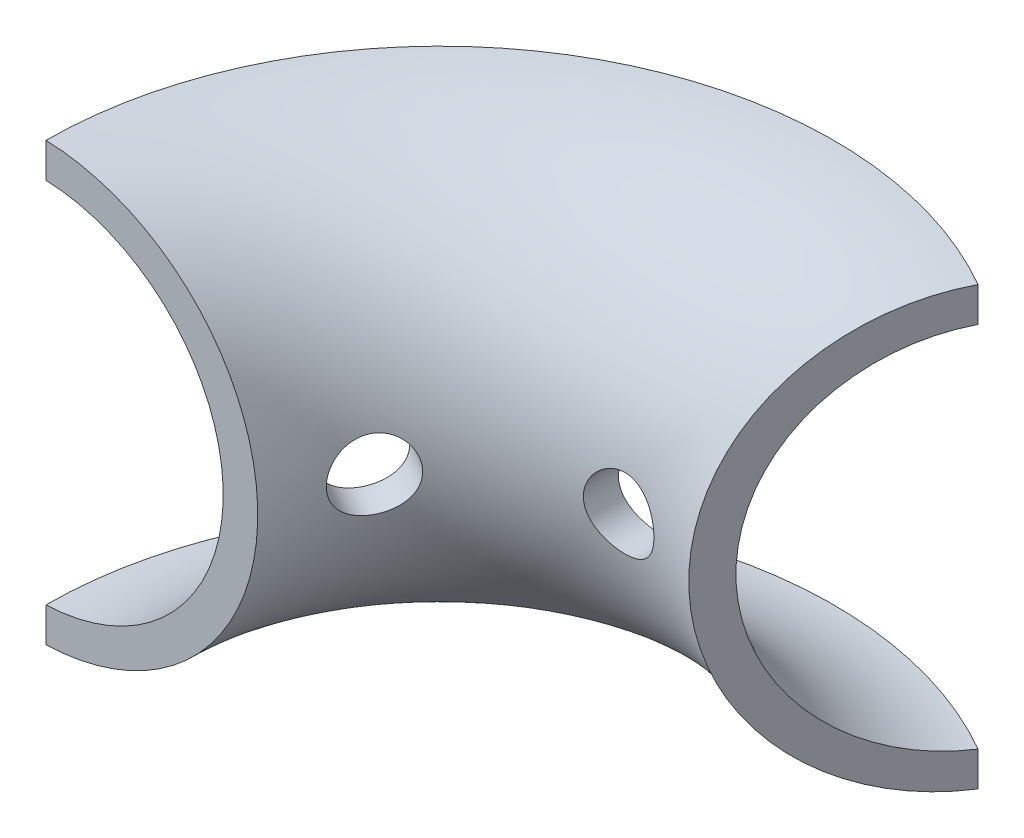
ISO-10303-21;
HEADER;
FILE_DESCRIPTION(('STEP AP214'),'2;1');
FILE_NAME('part.step','',(''),(''),'','','');
FILE_SCHEMA(('AUTOMOTIVE_DESIGN { 1 0 10303 214 1 1 1 1 }'));
ENDSEC;
DATA;
#1=APPLICATION_CONTEXT('core data for automotive mechanical design processes');
#2=APPLICATION_PROTOCOL_DEFINITION('international standard','automotive_design',2000,#1);
#3=PRODUCT_CONTEXT('',#1,'mechanical');
#4=PRODUCT('Part','Part','',(#3));
#5=PRODUCT_RELATED_PRODUCT_CATEGORY('part','',(#4));
#6=PRODUCT_DEFINITION_FORMATION('','',#4);
#7=PRODUCT_DEFINITION_CONTEXT('part definition',#1,'design');
#8=PRODUCT_DEFINITION('design','',#6,#7);
#9=PRODUCT_DEFINITION_SHAPE('','',#8);
#10=(LENGTH_UNIT() NAMED_UNIT(*) SI_UNIT(.MILLI.,.METRE.));
#11=(NAMED_UNIT(*) PLANE_ANGLE_UNIT() SI_UNIT($,.RADIAN.));
#12=(NAMED_UNIT(*) SI_UNIT($,.STERADIAN.) SOLID_ANGLE_UNIT());
#13=UNCERTAINTY_MEASURE_WITH_UNIT(LENGTH_MEASURE(1.E-05),#10,'distance_accuracy_value','');
#14=(GEOMETRIC_REPRESENTATION_CONTEXT(3) GLOBAL_UNCERTAINTY_ASSIGNED_CONTEXT((#13)) GLOBAL_UNIT_ASSIGNED_CONTEXT((#10,
#11,#12)) REPRESENTATION_CONTEXT('',''));
#15=CARTESIAN_POINT('',(0.,0.,0.));
#16=DIRECTION('',(0.,0.,1.));
#17=DIRECTION('',(1.,0.,0.));
#18=AXIS2_PLACEMENT_3D('',#15,#16,#17);
#19=CARTESIAN_POINT('',(44.2949999999999,0.,-25.5737301737545));
#20=DIRECTION('',(-0.86602540378444,0.,-0.499999999999998));
#21=DIRECTION('',(-0.499999999999998,0.,0.86602540378444));
#22=AXIS2_PLACEMENT_3D('',#19,#20,#21);
#23=PLANE('',#22);
#24=CARTESIAN_POINT('',(44.2949999999999,0.,-25.5737301737545));
#25=DIRECTION('',(-0.86602540378444,0.,-0.499999999999998));
#26=DIRECTION('',(-0.499999999999998,0.,0.86602540378444));
#27=AXIS2_PLACEMENT_3D('',#24,#25,#26);
#28=CIRCLE('',#27,16.105);
#29=CARTESIAN_POINT('',(44.0449999999999,-16.0972365640814,-25.1407174718623));
#30=VERTEX_POINT('',#29);
#31=CARTESIAN_POINT('',(44.0449999999999,16.0972365640814,-25.1407174718623));
#32=VERTEX_POINT('',#31);
#33=EDGE_CURVE('E81',#30,#32,#28,.T.);
#34=ORIENTED_EDGE('',*,*,#33,.F.);
#35=DIRECTION('',(0.,-1.,0.));
#36=VECTOR('',#35,1.);
#37=CARTESIAN_POINT('',(44.0449999999999,-16.0972365640814,-25.1407174718623));
#38=LINE('',#37,#36);
#39=CARTESIAN_POINT('',(44.0449999999999,-13.5507785754177,-25.1407174718623));
#40=VERTEX_POINT('',#39);
#41=EDGE_CURVE('E69',#40,#30,#38,.T.);
#42=ORIENTED_EDGE('',*,*,#41,.F.);
#43=CARTESIAN_POINT('',(44.2949999999999,0.,-25.5737301737545));
#44=DIRECTION('',(0.86602540378444,0.,0.499999999999998));
#45=DIRECTION('',(-0.499999999999998,0.,0.86602540378444));
#46=AXIS2_PLACEMENT_3D('',#43,#44,#45);
#47=CIRCLE('',#46,13.56);
#48=CARTESIAN_POINT('',(44.0449999999999,13.5507785754177,-25.1407174718623));
#49=VERTEX_POINT('',#48);
#50=EDGE_CURVE('E74',#49,#40,#47,.T.);
#51=ORIENTED_EDGE('',*,*,#50,.F.);
#52=DIRECTION('',(0.,-1.,0.));
#53=VECTOR('',#52,1.);
#54=CARTESIAN_POINT('',(44.0449999999999,16.0972365640814,-25.1407174718623));
#55=LINE('',#54,#53);
#56=EDGE_CURVE('E78',#32,#49,#55,.T.);
#57=ORIENTED_EDGE('',*,*,#56,.F.);
#58=EDGE_LOOP('',(#34,#42,#51,#57));
#59=FACE_BOUND('',#58,.T.);
#60=ADVANCED_FACE('F38',(#59),#23,.F.);
#61=CARTESIAN_POINT('',(0.,0.,0.));
#62=DIRECTION('',(0.,0.,1.));
#63=DIRECTION('',(1.,0.,0.));
#64=AXIS2_PLACEMENT_3D('',#61,#62,#63);
#65=PLANE('',#64);
#66=CARTESIAN_POINT('',(0.,0.,0.));
#67=DIRECTION('',(0.,0.,1.));
#68=DIRECTION('',(1.,0.,0.));
#69=AXIS2_PLACEMENT_3D('',#66,#67,#68);
#70=CIRCLE('',#69,16.105);
#71=CARTESIAN_POINT('',(0.500000000000007,-16.0972365640814,0.));
#72=VERTEX_POINT('',#71);
#73=CARTESIAN_POINT('',(0.500000000000007,16.0972365640814,0.));
#74=VERTEX_POINT('',#73);
#75=EDGE_CURVE('E98',#72,#74,#70,.T.);
#76=ORIENTED_EDGE('',*,*,#75,.T.);
#77=DIRECTION('',(0.,-1.,0.));
#78=VECTOR('',#77,1.);
#79=CARTESIAN_POINT('',(0.500000000000004,16.0972365640814,0.));
#80=LINE('',#79,#78);
#81=CARTESIAN_POINT('',(0.500000000000005,13.5507785754177,0.));
#82=VERTEX_POINT('',#81);
#83=EDGE_CURVE('E58',#74,#82,#80,.T.);
#84=ORIENTED_EDGE('',*,*,#83,.T.);
#85=CARTESIAN_POINT('',(0.,0.,0.));
#86=DIRECTION('',(0.,0.,-1.));
#87=DIRECTION('',(1.,0.,0.));
#88=AXIS2_PLACEMENT_3D('',#85,#86,#87);
#89=CIRCLE('',#88,13.56);
#90=CARTESIAN_POINT('',(0.500000000000004,-13.5507785754177,0.));
#91=VERTEX_POINT('',#90);
#92=EDGE_CURVE('E52',#82,#91,#89,.T.);
#93=ORIENTED_EDGE('',*,*,#92,.T.);
#94=DIRECTION('',(0.,-1.,0.));
#95=VECTOR('',#94,1.);
#96=CARTESIAN_POINT('',(0.500000000000004,-16.0972365640814,0.));
#97=LINE('',#96,#95);
#98=EDGE_CURVE('E11',#91,#72,#97,.T.);
#99=ORIENTED_EDGE('',*,*,#98,.T.);
#100=EDGE_LOOP('',(#76,#84,#93,#99));
#101=FACE_BOUND('',#100,.T.);
#102=ADVANCED_FACE('F135',(#101),#65,.T.);
#103=CARTESIAN_POINT('',(29.53,0.,0.));
#104=DIRECTION('',(0.,1.,0.));
#105=DIRECTION('',(0.,0.,1.));
#106=AXIS2_PLACEMENT_3D('',#103,#104,#105);
#107=TOROIDAL_SURFACE('',#106,29.53,16.105);
#108=CARTESIAN_POINT('',(27.7740271270852,1.91743559724648,-13.4252));
#109=CARTESIAN_POINT('',(27.6666933513547,1.81913378740206,-13.3992731930195));
#110=CARTESIAN_POINT('',(27.567584001212,1.71176696967699,-13.3729036746234));
#111=CARTESIAN_POINT('',(27.3884140460133,1.48153353165593,-13.3221542333845));
#112=CARTESIAN_POINT('',(27.3083840845655,1.35864245549103,-13.2977775519655));
#113=CARTESIAN_POINT('',(27.1697218467155,1.10026924068495,-13.2537770078409));
#114=CARTESIAN_POINT('',(27.1111184042808,0.964770440829677,-13.2341595615552));
#115=CARTESIAN_POINT('',(27.0175602464365,0.685099184341573,-13.2021212578841));
#116=CARTESIAN_POINT('',(26.9825880799598,0.540933214049031,-13.1896950909063));
#117=CARTESIAN_POINT('',(26.9385011840134,0.253816949068898,-13.1739307515622));
#118=CARTESIAN_POINT('',(26.928457316239,0.111027400604963,-13.1702662123766));
#119=CARTESIAN_POINT('',(26.9319266458047,-0.174218058510046,-13.1715222926748));
#120=CARTESIAN_POINT('',(26.9454370446311,-0.316674006783006,-13.1764418922657));
#121=CARTESIAN_POINT('',(26.9945999789083,-0.592172289418696,-13.1939451777186));
#122=CARTESIAN_POINT('',(27.0294855782491,-0.725370024919686,-13.2062631229108));
#123=CARTESIAN_POINT('',(27.1195011908097,-0.984000927334418,-13.2369579396884));
#124=CARTESIAN_POINT('',(27.1746371560329,-1.10943179872603,-13.2553365924793));
#125=CARTESIAN_POINT('',(27.3083045800673,-1.35849031424794,-13.2977524840224));
#126=CARTESIAN_POINT('',(27.3882665908346,-1.48129604132837,-13.3221080499601));
#127=CARTESIAN_POINT('',(27.5673767187898,-1.71154848421269,-13.3728493561855));
#128=CARTESIAN_POINT('',(27.666529956115,-1.81899108787009,-13.3992356371251));
#129=CARTESIAN_POINT('',(27.8798979337904,-2.01439070340703,-13.4507715384725));
#130=CARTESIAN_POINT('',(27.9938621071623,-2.10261792660322,-13.4759338290115));
#131=CARTESIAN_POINT('',(28.2353005093822,-2.25930363527613,-13.5227793134489));
#132=CARTESIAN_POINT('',(28.3627721330961,-2.32776592329395,-13.5444631761986));
#133=CARTESIAN_POINT('',(28.6287184168448,-2.44311125632345,-13.5820705496654));
#134=CARTESIAN_POINT('',(28.7672435804161,-2.48988771891842,-13.5979655286832));
#135=CARTESIAN_POINT('',(29.0508032302377,-2.55962238479875,-13.6219801545594));
#136=CARTESIAN_POINT('',(29.1958354191147,-2.58258892645291,-13.630102523353));
#137=CARTESIAN_POINT('',(29.4822810035721,-2.60337252708632,-13.6374472948394));
#138=CARTESIAN_POINT('',(29.6236186294456,-2.60212416834965,-13.6370004375613));
#139=CARTESIAN_POINT('',(29.9040099661558,-2.57680656063368,-13.6280667976476));
#140=CARTESIAN_POINT('',(30.0430630948798,-2.55273158421706,-13.6195779972047));
#141=CARTESIAN_POINT('',(30.3125449530755,-2.4832792110706,-13.5957244180682));
#142=CARTESIAN_POINT('',(30.4430796600204,-2.43826836386045,-13.5804781586054));
#143=CARTESIAN_POINT('',(30.6946817143149,-2.32858675500714,-13.5447445945851));
#144=CARTESIAN_POINT('',(30.8157598055395,-2.26393872441065,-13.5242633541093));
#145=CARTESIAN_POINT('',(30.993833575831,-2.15007339903251,-13.4900774232287));
#146=CARTESIAN_POINT('',(31.0550999766784,-2.10704920600383,-13.4774832017718));
#147=CARTESIAN_POINT('',(31.1736241011888,-2.01595791481985,-13.4516981966232));
#148=CARTESIAN_POINT('',(31.2308818271033,-1.96789081949689,-13.4385074132665));
#149=CARTESIAN_POINT('',(31.3933066486452,-1.81913378740192,-13.3992731930195));
#150=CARTESIAN_POINT('',(31.4924159987879,-1.71176696967684,-13.3729036746234));
#151=CARTESIAN_POINT('',(31.6715859539865,-1.48153353165576,-13.3221542333845));
#152=CARTESIAN_POINT('',(31.7516159154343,-1.35864245549087,-13.2977775519655));
#153=CARTESIAN_POINT('',(31.8902781532843,-1.10026924068477,-13.2537770078409));
#154=CARTESIAN_POINT('',(31.9488815957189,-0.9647704408295,-13.2341595615552));
#155=CARTESIAN_POINT('',(32.0424397535632,-0.685099184341391,-13.2021212578841));
#156=CARTESIAN_POINT('',(32.07741192004,-0.540933214048848,-13.1896950909064));
#157=CARTESIAN_POINT('',(32.1214988159863,-0.253816949068715,-13.1739307515622));
#158=CARTESIAN_POINT('',(32.1315426837607,-0.11102740060478,-13.1702662123767));
#159=CARTESIAN_POINT('',(32.128073354195,0.174218058510225,-13.1715222926748));
#160=CARTESIAN_POINT('',(32.1145629553686,0.316674006783184,-13.1764418922657));
#161=CARTESIAN_POINT('',(32.0654000210913,0.592172289418869,-13.1939451777186));
#162=CARTESIAN_POINT('',(32.0305144217506,0.725370024919858,-13.2062631229108));
#163=CARTESIAN_POINT('',(31.94049880919,0.984000927334584,-13.2369579396884));
#164=CARTESIAN_POINT('',(31.8853628439668,1.10943179872619,-13.2553365924794));
#165=CARTESIAN_POINT('',(31.7516954199323,1.35849031424803,-13.2977524840224));
#166=CARTESIAN_POINT('',(31.6717334091651,1.4812960413284,-13.3221080499601));
#167=CARTESIAN_POINT('',(31.4926232812099,1.71154848421261,-13.3728493561855));
#168=CARTESIAN_POINT('',(31.3934700438848,1.81899108786997,-13.3992356371251));
#169=CARTESIAN_POINT('',(31.1801020662094,2.01439070340688,-13.4507715384725));
#170=CARTESIAN_POINT('',(31.0661378928376,2.10261792660308,-13.4759338290115));
#171=CARTESIAN_POINT('',(30.8246994906176,2.25930363527602,-13.5227793134489));
#172=CARTESIAN_POINT('',(30.6972278669038,2.32776592329386,-13.5444631761986));
#173=CARTESIAN_POINT('',(30.4312815831551,2.44311125632338,-13.5820705496654));
#174=CARTESIAN_POINT('',(30.2927564195838,2.48988771891836,-13.5979655286832));
#175=CARTESIAN_POINT('',(30.0091967697622,2.55962238479871,-13.6219801545594));
#176=CARTESIAN_POINT('',(29.8641645808852,2.58258892645289,-13.630102523353));
#177=CARTESIAN_POINT('',(29.5777189964278,2.60337252708632,-13.6374472948394));
#178=CARTESIAN_POINT('',(29.4363813705543,2.60212416834966,-13.6370004375613));
#179=CARTESIAN_POINT('',(29.1559900338441,2.57680656063371,-13.6280667976476));
#180=CARTESIAN_POINT('',(29.0169369051201,2.5527315842171,-13.6195779972047));
#181=CARTESIAN_POINT('',(28.7474550469244,2.48327921107066,-13.5957244180682));
#182=CARTESIAN_POINT('',(28.6169203399795,2.43826836386052,-13.5804781586054));
#183=CARTESIAN_POINT('',(28.365318285685,2.32858675500723,-13.5447445945851));
#184=CARTESIAN_POINT('',(28.2442401944604,2.26393872441075,-13.5242633541093));
#185=CARTESIAN_POINT('',(28.0661664241689,2.15007339903263,-13.4900774232287));
#186=CARTESIAN_POINT('',(28.0049000233215,2.10704920600395,-13.4774832017718));
#187=CARTESIAN_POINT('',(27.8863758988111,2.01595791481997,-13.4516981966232));
#188=CARTESIAN_POINT('',(27.8291181728966,1.96789081949702,-13.4385074132665));
#189=CARTESIAN_POINT('',(27.7740271270852,1.91743559724648,-13.4252));
#190=B_SPLINE_CURVE_WITH_KNOTS('',3,(#108,#109,#110,#111,#112,#113,#114,#115,#116,#117,#118,
#119,#120,#121,#122,#123,#124,#125,#126,#127,#128,#129,#130,#131,#132,#133,#134,#135,#136,#137,
#138,#139,#140,#141,#142,#143,#144,#145,#146,#147,#148,#149,#150,#151,#152,#153,#154,#155,#156,
#157,#158,#159,#160,#161,#162,#163,#164,#165,#166,#167,#168,#169,#170,#171,#172,#173,#174,#175,
#176,#177,#178,#179,#180,#181,#182,#183,#184,#185,#186,#187,#188,#189),.UNSPECIFIED.,.T.,.F.,(4,
2,2,2,2,2,2,2,2,2,2,2,2,2,2,2,2,2,2,2,2,2,2,2,2,2,2,2,2,2,2,2,2,2,2,2,2,2,2,2,4),(0.,
0.443243041076696,0.887193254465349,1.33173871790359,1.77595553654519,2.20334848540759,
2.63069065860831,3.04353126535077,3.45649331176083,3.90004735602049,4.34371990212992,
4.78067996299103,5.21755590176765,5.65655682993328,6.095403965507,6.51734855365619,
6.93939904014373,7.35432331295922,7.76876910822953,7.99627192577259,8.22377461553923,
8.66701765661592,9.11096787000457,9.5555133334428,9.99973015208439,10.4271231009468,
10.8544652741475,11.26730588089,11.6802679273,12.1238219715595,12.5674945176687,
13.0044545785298,13.4413305173064,13.8803314454721,14.3191785810458,14.741123169195,
15.1631736556825,15.578097928498,15.9925437237683,16.2200465413114,16.447549231078),.UNSPECIFIED.);
#191=CARTESIAN_POINT('',(27.7740271270852,1.91743559724648,-13.4252));
#192=VERTEX_POINT('',#191);
#193=EDGE_CURVE('E209',#192,#192,#190,.T.);
#194=ORIENTED_EDGE('',*,*,#193,.F.);
#195=EDGE_LOOP('',(#194));
#196=FACE_BOUND('',#195,.T.);
#197=CARTESIAN_POINT('',(18.4092777809172,-2.30368709512397,-7.81244552963564));
#198=CARTESIAN_POINT('',(18.493732830746,-2.23494481910977,-7.91538120423777));
#199=CARTESIAN_POINT('',(18.5773075762874,-2.15511333905659,-8.01164922978648));
#200=CARTESIAN_POINT('',(18.7387281646816,-1.9756601886987,-8.18946348829229));
#201=CARTESIAN_POINT('',(18.816571277928,-1.87602917163454,-8.27100273340321));
#202=CARTESIAN_POINT('',(18.9625647441967,-1.65960352791205,-8.41843329868064));
#203=CARTESIAN_POINT('',(19.0307173162618,-1.54281284315189,-8.4843282035762));
#204=CARTESIAN_POINT('',(19.1535415493464,-1.29494794274804,-8.5998023986373));
#205=CARTESIAN_POINT('',(19.208216242766,-1.16387694963083,-8.64938535968322));
#206=CARTESIAN_POINT('',(19.3002938160859,-0.891847520912635,-8.73133468955648));
#207=CARTESIAN_POINT('',(19.3378191189983,-0.750967713202515,-8.76382334876179));
#208=CARTESIAN_POINT('',(19.3934794008226,-0.462622944914034,-8.81158764057463));
#209=CARTESIAN_POINT('',(19.4116226235367,-0.315160811829136,-8.82687059145467));
#210=CARTESIAN_POINT('',(19.4267089342242,-0.0264872531104022,-8.8395914134809));
#211=CARTESIAN_POINT('',(19.424752916237,0.114627155068202,-8.83795592258633));
#212=CARTESIAN_POINT('',(19.4024198701347,0.39431752634409,-8.81908668427337));
#213=CARTESIAN_POINT('',(19.382043968075,0.532893644085327,-8.80185389035858));
#214=CARTESIAN_POINT('',(19.3247891463594,0.801200678337776,-8.75252247105437));
#215=CARTESIAN_POINT('',(19.2882035974945,0.931043557560608,-8.7206877728098));
#216=CARTESIAN_POINT('',(19.2008370001808,1.18129379274543,-8.64267615191682));
#217=CARTESIAN_POINT('',(19.1500527283599,1.30169899822521,-8.59649597231476));
#218=CARTESIAN_POINT('',(19.0344172232534,1.53564204466682,-8.48783355697069));
#219=CARTESIAN_POINT('',(18.9690274146904,1.64861120359234,-8.42470048495273));
#220=CARTESIAN_POINT('',(18.8290841716057,1.8587138291797,-8.28386469078458));
#221=CARTESIAN_POINT('',(18.7545279763798,1.95584250446133,-8.20615757554777));
#222=CARTESIAN_POINT('',(18.5965593670985,2.13555196082614,-8.03343468644277));
#223=CARTESIAN_POINT('',(18.5129083960785,2.21736653613392,-7.93783675093282));
#224=CARTESIAN_POINT('',(18.3435127815738,2.35879117083283,-7.73302035740976));
#225=CARTESIAN_POINT('',(18.2577685557402,2.41840562168133,-7.62380459888105));
#226=CARTESIAN_POINT('',(18.0902039004478,2.51216177282715,-7.39670080003757));
#227=CARTESIAN_POINT('',(18.0083387413253,2.54688607587298,-7.2790872545781));
#228=CARTESIAN_POINT('',(17.8498089650513,2.59178732487799,-7.03595440089718));
#229=CARTESIAN_POINT('',(17.7731424104359,2.60197346535884,-6.91043807196772));
#230=CARTESIAN_POINT('',(17.6314551072809,2.59750894647306,-6.66186938752624));
#231=CARTESIAN_POINT('',(17.5660399958501,2.58409745351389,-6.53901739608727));
#232=CARTESIAN_POINT('',(17.4438729060871,2.53532705988675,-6.29337910338578));
#233=CARTESIAN_POINT('',(17.3871211020542,2.49996771771723,-6.17059280349443));
#234=CARTESIAN_POINT('',(17.2829452460666,2.40855429524193,-5.92888523062313));
#235=CARTESIAN_POINT('',(17.2355202585927,2.35250229212203,-5.80996357100327));
#236=CARTESIAN_POINT('',(17.1498578438344,2.22140554233176,-5.57951235574759));
#237=CARTESIAN_POINT('',(17.1116228268835,2.14635582353904,-5.46798474495563));
#238=CARTESIAN_POINT('',(17.0419793511865,1.9749794696271,-5.25028422604965));
#239=CARTESIAN_POINT('',(17.0110112481065,1.87777217729466,-5.14466320982665));
#240=CARTESIAN_POINT('',(16.9573791476561,1.66692544754406,-4.94878980163293));
#241=CARTESIAN_POINT('',(16.9347172757328,1.55328181465896,-4.85854134644108));
#242=CARTESIAN_POINT('',(16.8959239905767,1.30871156538634,-4.69445162705195));
#243=CARTESIAN_POINT('',(16.8800020129457,1.17737796483435,-4.62116481201646));
#244=CARTESIAN_POINT('',(16.8544470498644,0.903627275221984,-4.49789284948723));
#245=CARTESIAN_POINT('',(16.8448119130326,0.761213996362718,-4.44789973247453));
#246=CARTESIAN_POINT('',(16.8311589468247,0.475028266603707,-4.37528263323392));
#247=CARTESIAN_POINT('',(16.8269428374437,0.331509966574485,-4.35169691542211));
#248=CARTESIAN_POINT('',(16.8230375833491,0.0425156788767855,-4.32989447816028));
#249=CARTESIAN_POINT('',(16.8233470527571,-0.102959695838766,-4.3316699922784));
#250=CARTESIAN_POINT('',(16.8284028960978,-0.384541482320305,-4.35978736335347));
#251=CARTESIAN_POINT('',(16.8329418158682,-0.520768558256625,-4.38498044915596));
#252=CARTESIAN_POINT('',(16.8465810829881,-0.787116449042564,-4.45702655846492));
#253=CARTESIAN_POINT('',(16.8556819406186,-0.91723657901155,-4.50388200499447));
#254=CARTESIAN_POINT('',(16.8793767230548,-1.17028579398124,-4.61811535246334));
#255=CARTESIAN_POINT('',(16.8940625290332,-1.29305248916912,-4.68583271673828));
#256=CARTESIAN_POINT('',(16.9298990466809,-1.52611569189381,-4.83876850079624));
#257=CARTESIAN_POINT('',(16.951051746943,-1.63640834930863,-4.92399230122125));
#258=CARTESIAN_POINT('',(17.0022738540175,-1.84774858229028,-5.11404322459452));
#259=CARTESIAN_POINT('',(17.0327680014404,-1.94795951787989,-5.2196880995943));
#260=CARTESIAN_POINT('',(17.1033394843029,-2.12929144547522,-5.44346285161197));
#261=CARTESIAN_POINT('',(17.1434179779741,-2.21041012790273,-5.56159423661317));
#262=CARTESIAN_POINT('',(17.2345277568876,-2.35203953591468,-5.8078428739303));
#263=CARTESIAN_POINT('',(17.285683006118,-2.41229511373585,-5.93606172770897));
#264=CARTESIAN_POINT('',(17.3987895369924,-2.50868679041184,-6.19673053201077));
#265=CARTESIAN_POINT('',(17.4607365754435,-2.54483234214652,-6.3291788029272));
#266=CARTESIAN_POINT('',(17.591313082415,-2.59043058214106,-6.58727174497743));
#267=CARTESIAN_POINT('',(17.6594817437483,-2.60107632215196,-6.7129390757256));
#268=CARTESIAN_POINT('',(17.8029894930983,-2.59875226461304,-6.95985395616432));
#269=CARTESIAN_POINT('',(17.8783266105144,-2.58578893949515,-7.0811027079146));
#270=CARTESIAN_POINT('',(18.0292161701733,-2.53815789018644,-7.30919184703205));
#271=CARTESIAN_POINT('',(18.1045236679758,-2.50473721559238,-7.41645852433272));
#272=CARTESIAN_POINT('',(18.2565507903639,-2.41843738973643,-7.6217670951299));
#273=CARTESIAN_POINT('',(18.3332707849661,-2.36555306886119,-7.71980652914282));
#274=CARTESIAN_POINT('',(18.4092777809172,-2.30368709512397,-7.81244552963564));
#275=B_SPLINE_CURVE_WITH_KNOTS('',3,(#197,#198,#199,#200,#201,#202,#203,#204,#205,#206,#207,
#208,#209,#210,#211,#212,#213,#214,#215,#216,#217,#218,#219,#220,#221,#222,#223,#224,#225,#226,
#227,#228,#229,#230,#231,#232,#233,#234,#235,#236,#237,#238,#239,#240,#241,#242,#243,#244,#245,
#246,#247,#248,#249,#250,#251,#252,#253,#254,#255,#256,#257,#258,#259,#260,#261,#262,#263,#264,
#265,#266,#267,#268,#269,#270,#271,#272,#273,#274),.UNSPECIFIED.,.T.,.F.,(4,2,2,2,2,2,2,2,2,2,2,
2,2,2,2,2,2,2,2,2,2,2,2,2,2,2,2,2,2,2,2,2,2,2,2,2,2,2,4),(0.,0.449037637861826,
0.898287758447054,1.3474348387249,1.79648077257499,2.24226904688687,2.68786763798273,
3.10919555642364,3.53049771973552,3.9444680192574,4.35853237408977,4.79159764087838,
5.22479365792115,5.67587503388739,6.12686713295777,6.5669237606707,7.00681547220557,
7.42429149071836,7.84177590742456,8.25921842729396,8.67677031426736,9.11533451836779,
9.55401086663041,10.0054643734961,10.4567633100595,10.891029650704,11.3251630077607,
11.7390635747338,12.1530104493723,12.5740846275628,12.9952884179979,13.4395504018674,
13.8838661002474,14.3334381157334,14.782833762595,15.2107537186589,15.6385563780038,
16.0425693151061,16.4466896370058),.UNSPECIFIED.);
#276=CARTESIAN_POINT('',(18.4092777809172,-2.30368709512397,-7.81244552963564));
#277=VERTEX_POINT('',#276);
#278=EDGE_CURVE('E87',#277,#277,#275,.T.);
#279=ORIENTED_EDGE('',*,*,#278,.F.);
#280=EDGE_LOOP('',(#279));
#281=FACE_BOUND('',#280,.T.);
#282=CARTESIAN_POINT('',(29.53,16.0972365640814,0.));
#283=DIRECTION('',(0.,1.,0.));
#284=DIRECTION('',(0.499999999999998,0.,-0.86602540378444));
#285=AXIS2_PLACEMENT_3D('',#282,#283,#284);
#286=CIRCLE('',#285,29.03);
#287=EDGE_CURVE('E102',#32,#74,#286,.T.);
#288=ORIENTED_EDGE('',*,*,#287,.T.);
#289=ORIENTED_EDGE('',*,*,#75,.F.);
#290=CARTESIAN_POINT('',(29.53,-16.0972365640814,0.));
#291=DIRECTION('',(0.,1.,0.));
#292=DIRECTION('',(0.499999999999998,0.,-0.86602540378444));
#293=AXIS2_PLACEMENT_3D('',#290,#291,#292);
#294=CIRCLE('',#293,29.03);
#295=EDGE_CURVE('E93',#30,#72,#294,.T.);
#296=ORIENTED_EDGE('',*,*,#295,.F.);
#297=ORIENTED_EDGE('',*,*,#33,.T.);
#298=EDGE_LOOP('',(#288,#289,#296,#297));
#299=FACE_BOUND('',#298,.T.);
#300=ADVANCED_FACE('F97',(#196,#281,#299),#107,.T.);
#301=CARTESIAN_POINT('',(29.53,0.,0.));
#302=DIRECTION('',(0.,1.,0.));
#303=DIRECTION('',(0.,0.,1.));
#304=AXIS2_PLACEMENT_3D('',#301,#302,#303);
#305=CYLINDRICAL_SURFACE('',#304,29.03);
#306=CARTESIAN_POINT('',(29.53,13.5507785754177,0.));
#307=DIRECTION('',(0.,1.,0.));
#308=DIRECTION('',(0.499999999999998,0.,-0.86602540378444));
#309=AXIS2_PLACEMENT_3D('',#306,#307,#308);
#310=CIRCLE('',#309,29.03);
#311=EDGE_CURVE('E110',#49,#82,#310,.T.);
#312=ORIENTED_EDGE('',*,*,#311,.T.);
#313=ORIENTED_EDGE('',*,*,#83,.F.);
#314=ORIENTED_EDGE('',*,*,#287,.F.);
#315=ORIENTED_EDGE('',*,*,#56,.T.);
#316=EDGE_LOOP('',(#312,#313,#314,#315));
#317=FACE_BOUND('',#316,.T.);
#318=ADVANCED_FACE('F123',(#317),#305,.T.);
#319=CARTESIAN_POINT('',(29.53,0.,0.));
#320=DIRECTION('',(0.,1.,0.));
#321=DIRECTION('',(0.,0.,1.));
#322=AXIS2_PLACEMENT_3D('',#319,#320,#321);
#323=TOROIDAL_SURFACE('',#322,29.53,13.56);
#324=CARTESIAN_POINT('',(27.7668233562816,-1.91081347166613,-16.0085011793387));
#325=CARTESIAN_POINT('',(27.6597846464621,-1.81204473276444,-15.9825697176331));
#326=CARTESIAN_POINT('',(27.5611024132703,-1.70431663749474,-15.9562738748837));
#327=CARTESIAN_POINT('',(27.3829403846281,-1.47355943170288,-15.9058081694969));
#328=CARTESIAN_POINT('',(27.3034590704929,-1.35053153247593,-15.881638138816));
#329=CARTESIAN_POINT('',(27.1658500330112,-1.09191747309765,-15.8380941273032));
#330=CARTESIAN_POINT('',(27.1077653704884,-0.956306668650228,-15.8187298433148));
#331=CARTESIAN_POINT('',(27.0152245125778,-0.676461263598407,-15.7871959453736));
#332=CARTESIAN_POINT('',(26.9807595246765,-0.53222989379349,-15.7750236544071));
#333=CARTESIAN_POINT('',(26.9376637677014,-0.245086090100376,-15.7597132412496));
#334=CARTESIAN_POINT('',(26.9281045212361,-0.102330374970481,-15.7562506044534));
#335=CARTESIAN_POINT('',(26.9325174628387,0.182755803104825,-15.7578365014277));
#336=CARTESIAN_POINT('',(26.946486180006,0.32508632567272,-15.7628837797956));
#337=CARTESIAN_POINT('',(26.9965425459448,0.600454406520289,-15.7805719745308));
#338=CARTESIAN_POINT('',(27.0318939298961,0.733643652411569,-15.79295985651));
#339=CARTESIAN_POINT('',(27.1228463166056,0.99216825903294,-15.8237506785965));
#340=CARTESIAN_POINT('',(27.1784506747634,1.11750231432378,-15.8421546153582));
#341=CARTESIAN_POINT('',(27.3104136587317,1.36135615645604,-15.8837528504458));
#342=CARTESIAN_POINT('',(27.3873987894189,1.47951266711161,-15.9070856422926));
#343=CARTESIAN_POINT('',(27.5591792457053,1.70164431528104,-15.9557143379992));
#344=CARTESIAN_POINT('',(27.6539803530217,1.80561483013576,-15.9810108775741));
#345=CARTESIAN_POINT('',(27.8643546752548,2.00183290710951,-16.0322746025175));
#346=CARTESIAN_POINT('',(27.9807327218887,2.09322804597509,-16.058211543856));
#347=CARTESIAN_POINT('',(28.2278272578387,2.25525327642035,-16.1065367947673));
#348=CARTESIAN_POINT('',(28.3585432699629,2.32588405878553,-16.1289252223801));
#349=CARTESIAN_POINT('',(28.6300013920025,2.44371486144387,-16.1674218281736));
#350=CARTESIAN_POINT('',(28.7706718051096,2.49106612365452,-16.183570394458));
#351=CARTESIAN_POINT('',(29.0586595423584,2.56120610631085,-16.2078167576057));
#352=CARTESIAN_POINT('',(29.2059739722511,2.58400541636958,-16.2159180252686));
#353=CARTESIAN_POINT('',(29.4946879552871,2.6035698190191,-16.2228615816578));
#354=CARTESIAN_POINT('',(29.6359886065539,2.60164722647439,-16.2221706107943));
#355=CARTESIAN_POINT('',(29.9161374703996,2.57501307963767,-16.2127402898439));
#356=CARTESIAN_POINT('',(30.0549858491413,2.55030307547529,-16.2040014872165));
#357=CARTESIAN_POINT('',(30.3239353763327,2.47965241130746,-16.1796869080875));
#358=CARTESIAN_POINT('',(30.4541457056236,2.43408314849921,-16.1642309636213));
#359=CARTESIAN_POINT('',(30.7051549956907,2.32332544967505,-16.1281384616039));
#360=CARTESIAN_POINT('',(30.8259519388556,2.25813282218005,-16.1075007974126));
#361=CARTESIAN_POINT('',(31.0604000729265,2.1067004513547,-16.0621336510551));
#362=CARTESIAN_POINT('',(31.1735133150455,2.01966980012428,-16.0372654178061));
#363=CARTESIAN_POINT('',(31.3839498297757,1.82841434098486,-15.986707290758));
#364=CARTESIAN_POINT('',(31.4812681609315,1.7241841726761,-15.9610171428197));
#365=CARTESIAN_POINT('',(31.6614584650955,1.49627817540898,-15.9104401897447));
#366=CARTESIAN_POINT('',(31.7435591436915,1.37197287146018,-15.8856315113552));
#367=CARTESIAN_POINT('',(31.8856215272035,1.11048317073214,-15.8408916912181));
#368=CARTESIAN_POINT('',(31.9455874227047,0.973301217951195,-15.8209596264652));
#369=CARTESIAN_POINT('',(32.0401797392256,0.693080978935253,-15.7887932240368));
#370=CARTESIAN_POINT('',(32.075349246274,0.550245668482888,-15.7763947852363));
#371=CARTESIAN_POINT('',(32.1211011883027,0.260233787213354,-15.7601620845742));
#372=CARTESIAN_POINT('',(32.1316934373875,0.113058973015086,-15.7563244042842));
#373=CARTESIAN_POINT('',(32.1279651838837,-0.17313321004626,-15.7576619347102));
#374=CARTESIAN_POINT('',(32.1149289599899,-0.31217148343526,-15.762372537034));
#375=CARTESIAN_POINT('',(32.066929288302,-0.585919873104593,-15.7793548772921));
#376=CARTESIAN_POINT('',(32.0319651864953,-0.720629860165118,-15.7916268407486));
#377=CARTESIAN_POINT('',(31.9413807815185,-0.982024360521131,-15.8223437595239));
#378=CARTESIAN_POINT('',(31.8857745591882,-1.10871427583942,-15.8407845060162));
#379=CARTESIAN_POINT('',(31.7555882443824,-1.35118711821017,-15.8818966882567));
#380=CARTESIAN_POINT('',(31.6810030796956,-1.46696711818381,-15.9045692545463));
#381=CARTESIAN_POINT('',(31.5104433039104,-1.69075376257027,-15.9531173773293));
#382=CARTESIAN_POINT('',(31.413559649078,-1.79804534318492,-15.979098087677));
#383=CARTESIAN_POINT('',(31.2032856842229,-1.99521859149768,-16.0304846418665));
#384=CARTESIAN_POINT('',(31.0898913821069,-2.08509603636461,-16.0558903449563));
#385=CARTESIAN_POINT('',(30.8457983519464,-2.24738883680511,-16.1040950937564));
#386=CARTESIAN_POINT('',(30.7146960555904,-2.31922830110015,-16.1267982765095));
#387=CARTESIAN_POINT('',(30.4413445216563,-2.43961755795615,-16.1660395968685));
#388=CARTESIAN_POINT('',(30.2990988962138,-2.48817486143815,-16.1825797223178));
#389=CARTESIAN_POINT('',(30.0131382700448,-2.55879787161332,-16.2069761607045));
#390=CARTESIAN_POINT('',(29.8696778543618,-2.58178769448954,-16.2151345199115));
#391=CARTESIAN_POINT('',(29.5807239198022,-2.60353644806754,-16.2228465849187));
#392=CARTESIAN_POINT('',(29.4352310652828,-2.60230311974522,-16.2224030396243));
#393=CARTESIAN_POINT('',(29.1532813283646,-2.57628169372543,-16.2131893508418));
#394=CARTESIAN_POINT('',(29.016712263478,-2.5525549672058,-16.2047944167759));
#395=CARTESIAN_POINT('',(28.7496150041033,-2.48395283734893,-16.1811509266486));
#396=CARTESIAN_POINT('',(28.6190881344133,-2.43907281988383,-16.1659008753269));
#397=CARTESIAN_POINT('',(28.3595137080849,-2.32620313865571,-16.1290341201208));
#398=CARTESIAN_POINT('',(28.2310648325368,-2.25694802786499,-16.1070799870022));
#399=CARTESIAN_POINT('',(27.9879282609352,-2.09835675696091,-16.0597051953985));
#400=CARTESIAN_POINT('',(27.873245561962,-2.0090133384612,-16.0342832852318));
#401=CARTESIAN_POINT('',(27.7668233562816,-1.91081347166613,-16.0085011793387));
#402=B_SPLINE_CURVE_WITH_KNOTS('',3,(#324,#325,#326,#327,#328,#329,#330,#331,#332,#333,#334,
#335,#336,#337,#338,#339,#340,#341,#342,#343,#344,#345,#346,#347,#348,#349,#350,#351,#352,#353,
#354,#355,#356,#357,#358,#359,#360,#361,#362,#363,#364,#365,#366,#367,#368,#369,#370,#371,#372,
#373,#374,#375,#376,#377,#378,#379,#380,#381,#382,#383,#384,#385,#386,#387,#388,#389,#390,#391,
#392,#393,#394,#395,#396,#397,#398,#399,#400,#401),.UNSPECIFIED.,.T.,.F.,(4,2,2,2,2,2,2,2,2,2,2,
2,2,2,2,2,2,2,2,2,2,2,2,2,2,2,2,2,2,2,2,2,2,2,2,2,2,2,4),(0.,0.443302648304547,0.88657022237285,
1.33072506213684,1.77471447364066,2.20189835971321,2.62901923213074,3.04220961650098,
3.4554684871077,3.88241734488051,4.30950499794134,4.7580694600112,5.20661899761686,
5.65221457622274,6.09761788592031,6.5194799765331,6.9413133717986,7.35591187187349,
7.77059899159199,8.20329046648148,8.63611704953188,9.08698589019394,9.53776932796122,
9.97834429852371,10.4187433099329,10.8359185907108,11.2531063145923,11.6700099789377,
12.0870251799803,12.5256784227421,12.9644379037134,13.4158033217496,13.8670230293063,
14.3013424339946,14.7355230457858,15.1501855447554,15.5649385351708,16.0055284687868,
16.44627785465),.UNSPECIFIED.);
#403=CARTESIAN_POINT('',(27.7668233562816,-1.91081347166613,-16.0085011793387));
#404=VERTEX_POINT('',#403);
#405=EDGE_CURVE('E217',#404,#404,#402,.T.);
#406=ORIENTED_EDGE('',*,*,#405,.F.);
#407=EDGE_LOOP('',(#406));
#408=FACE_BOUND('',#407,.T.);
#409=CARTESIAN_POINT('',(15.6854015800997,-2.57066507215536,-8.44289525398007));
#410=CARTESIAN_POINT('',(15.6102622845696,-2.59151176430013,-8.3274163692237));
#411=CARTESIAN_POINT('',(15.5375090466518,-2.60130237493592,-8.20841517396725));
#412=CARTESIAN_POINT('',(15.3991055422452,-2.59842052223228,-7.96664187422577));
#413=CARTESIAN_POINT('',(15.3334533103211,-2.58575429152494,-7.84387082531189));
#414=CARTESIAN_POINT('',(15.2108573195686,-2.53847544347557,-7.59838358488127));
#415=CARTESIAN_POINT('',(15.1539056491751,-2.50388291327663,-7.47566744592296));
#416=CARTESIAN_POINT('',(15.0492793412806,-2.41399174075564,-7.23392219928801));
#417=CARTESIAN_POINT('',(15.0016071228785,-2.35868771002396,-7.11489405983307));
#418=CARTESIAN_POINT('',(14.9144672423915,-2.22760268325676,-6.88153000901762));
#419=CARTESIAN_POINT('',(14.8752079623874,-2.15138956945611,-6.76735958669374));
#420=CARTESIAN_POINT('',(14.8055648723047,-1.98112283650455,-6.55014341529532));
#421=CARTESIAN_POINT('',(14.7751835817265,-1.88706416539696,-6.44710082942965));
#422=CARTESIAN_POINT('',(14.720945230344,-1.67815080781875,-6.25059887738432));
#423=CARTESIAN_POINT('',(14.6974951451676,-1.56248576962999,-6.15788629428751));
#424=CARTESIAN_POINT('',(14.6579932129834,-1.31673830025765,-5.99201233089449));
#425=CARTESIAN_POINT('',(14.6419413266391,-1.18665594573605,-5.91885084664521));
#426=CARTESIAN_POINT('',(14.6161186163826,-0.9160291229905,-5.79565105128874));
#427=CARTESIAN_POINT('',(14.6063208668843,-0.775532450360533,-5.74551388037314));
#428=CARTESIAN_POINT('',(14.5920244796054,-0.487698498929043,-5.67054637179786));
#429=CARTESIAN_POINT('',(14.5875234583601,-0.340364327968222,-5.64570465216465));
#430=CARTESIAN_POINT('',(14.5834676621957,-0.0515283187211881,-5.6233489994735));
#431=CARTESIAN_POINT('',(14.5836609711792,0.0898634526437733,-5.62444316625139));
#432=CARTESIAN_POINT('',(14.5883977267824,0.370343739179471,-5.65048610013573));
#433=CARTESIAN_POINT('',(14.5929408598195,0.50943241964668,-5.67543314766764));
#434=CARTESIAN_POINT('',(14.6066567107371,0.778728254744536,-5.74718805802146));
#435=CARTESIAN_POINT('',(14.6157398280347,0.909053946154195,-5.79357156706848));
#436=CARTESIAN_POINT('',(14.6391877698981,1.16043541234847,-5.90595133137376));
#437=CARTESIAN_POINT('',(14.6535537422458,1.28148916575046,-5.97195184813149));
#438=CARTESIAN_POINT('',(14.6892483990747,1.51666412627487,-6.12426935945568));
#439=CARTESIAN_POINT('',(14.7108551326834,1.63024747585911,-6.21135123471419));
#440=CARTESIAN_POINT('',(14.7619718680909,1.84176105951739,-6.40088835668382));
#441=CARTESIAN_POINT('',(14.7914843074164,1.93968645095625,-6.50334834055843));
#442=CARTESIAN_POINT('',(14.8609583294723,2.12131860679691,-6.7248641831271));
#443=CARTESIAN_POINT('',(14.9013105545708,2.20424459744554,-6.8444401596941));
#444=CARTESIAN_POINT('',(14.9926922781048,2.34804903599344,-7.09245974614293));
#445=CARTESIAN_POINT('',(15.0437198667906,2.40893142203052,-7.22090176719998));
#446=CARTESIAN_POINT('',(15.1553995809947,2.50543692967379,-7.4792858843581));
#447=CARTESIAN_POINT('',(15.2158151833952,2.54158645153008,-7.60913276107729));
#448=CARTESIAN_POINT('',(15.346229192416,2.58930724249204,-7.86851260440613));
#449=CARTESIAN_POINT('',(15.4162238550057,2.60088808536628,-7.99804567363685));
#450=CARTESIAN_POINT('',(15.5600394814205,2.59905363178569,-8.24584056245608));
#451=CARTESIAN_POINT('',(15.6334735162187,2.58690402376018,-8.36433848638887));
#452=CARTESIAN_POINT('',(15.7847960410975,2.54057389422954,-8.59393525689222));
#453=CARTESIAN_POINT('',(15.8626845974469,2.50639304489307,-8.70503399333356));
#454=CARTESIAN_POINT('',(16.0197998763513,2.41730918088996,-8.91711410522914));
#455=CARTESIAN_POINT('',(16.0990235630321,2.36244835322556,-9.01811555190177));
#456=CARTESIAN_POINT('',(16.2558291672886,2.23367453494697,-9.20858472657225));
#457=CARTESIAN_POINT('',(16.3334106545729,2.15975661623023,-9.29804946222284));
#458=CARTESIAN_POINT('',(16.487517374282,1.99062572762121,-9.46852019857214));
#459=CARTESIAN_POINT('',(16.5637937124215,1.89452945506795,-9.54887540271153));
#460=CARTESIAN_POINT('',(16.7073768178032,1.68579694767638,-9.69481379016167));
#461=CARTESIAN_POINT('',(16.7746812556926,1.57315643338921,-9.76039314029175));
#462=CARTESIAN_POINT('',(16.8986424975148,1.33033277216537,-9.87787866947676));
#463=CARTESIAN_POINT('',(16.9549135859945,1.1997205523663,-9.92930878522731));
#464=CARTESIAN_POINT('',(17.0506036746067,0.927200812101751,-10.0151012619921));
#465=CARTESIAN_POINT('',(17.0900281231886,0.785296961153805,-10.0494691417655));
#466=CARTESIAN_POINT('',(17.1481509402522,0.499645096837387,-10.0996577009108));
#467=CARTESIAN_POINT('',(17.1675484681949,0.356150164075946,-10.1161052359842));
#468=CARTESIAN_POINT('',(17.1866685226117,0.0669413234211941,-10.1323201488645));
#469=CARTESIAN_POINT('',(17.1863971877464,-0.0787718779547474,-10.1320927309313));
#470=CARTESIAN_POINT('',(17.1666965283177,-0.361024882397829,-10.1153801732532));
#471=CARTESIAN_POINT('',(17.148165251303,-0.497674653300397,-10.0996571222264));
#472=CARTESIAN_POINT('',(17.0945093999093,-0.765057258468323,-10.0533507245149));
#473=CARTESIAN_POINT('',(17.0593831330103,-0.895789487714027,-10.0227658620677));
#474=CARTESIAN_POINT('',(16.9740392012702,-1.1499312619668,-9.94660492968011));
#475=CARTESIAN_POINT('',(16.9236035582003,-1.27320194373747,-9.90081136380267));
#476=CARTESIAN_POINT('',(16.8106441035785,-1.50742945516716,-9.79488481452795));
#477=CARTESIAN_POINT('',(16.7481170293387,-1.61838294847271,-9.7347479597889));
#478=CARTESIAN_POINT('',(16.6104308137246,-1.83115567866348,-9.59705937482452));
#479=CARTESIAN_POINT('',(16.5347718132428,-1.93215792259138,-9.51874249556993));
#480=CARTESIAN_POINT('',(16.3771956487933,-2.11527875039973,-9.34758025999189));
#481=CARTESIAN_POINT('',(16.2952764305806,-2.19739109994455,-9.25473012411849));
#482=CARTESIAN_POINT('',(16.1240504145566,-2.34463409146973,-9.04975649869556));
#483=CARTESIAN_POINT('',(16.0345942926255,-2.40846111130793,-8.93681418602927));
#484=CARTESIAN_POINT('',(15.8575526115446,-2.50973817814219,-8.69836191825973));
#485=CARTESIAN_POINT('',(15.7699659998818,-2.54720346776894,-8.57285927370671));
#486=CARTESIAN_POINT('',(15.6854015800997,-2.57066507215536,-8.44289525398007));
#487=B_SPLINE_CURVE_WITH_KNOTS('',3,(#409,#410,#411,#412,#413,#414,#415,#416,#417,#418,#419,
#420,#421,#422,#423,#424,#425,#426,#427,#428,#429,#430,#431,#432,#433,#434,#435,#436,#437,#438,
#439,#440,#441,#442,#443,#444,#445,#446,#447,#448,#449,#450,#451,#452,#453,#454,#455,#456,#457,
#458,#459,#460,#461,#462,#463,#464,#465,#466,#467,#468,#469,#470,#471,#472,#473,#474,#475,#476,
#477,#478,#479,#480,#481,#482,#483,#484,#485,#486),.UNSPECIFIED.,.T.,.F.,(4,2,2,2,2,2,2,2,2,2,2,
2,2,2,2,2,2,2,2,2,2,2,2,2,2,2,2,2,2,2,2,2,2,2,2,2,2,2,4),(0.,0.417473293410689,
0.834830740157469,1.25180638852586,1.66889059485322,2.09534490779001,2.52192012768491,
2.97003838062281,3.41815425087151,3.86432762410843,4.31030014777218,4.73239566328381,
5.15446075186322,5.56850674438948,5.98264274799259,6.41496457478096,6.84741985091501,
7.29824688578795,7.74899333964521,8.18982010754893,8.63047506526939,9.04826775192946,
9.46606665561094,9.88301782505552,10.3000769250723,10.7380894464239,11.1762154673342,
11.627655385989,12.0789491916738,12.5138925566387,12.9487001761743,13.3631393214061,
13.7776207443394,14.1983049416721,14.6191028130017,15.0626278088132,15.5062989742856,
15.9764102258537,16.4462494302644),.UNSPECIFIED.);
#488=CARTESIAN_POINT('',(15.6854015800997,-2.57066507215536,-8.44289525398007));
#489=VERTEX_POINT('',#488);
#490=EDGE_CURVE('E216',#489,#489,#487,.T.);
#491=ORIENTED_EDGE('',*,*,#490,.F.);
#492=EDGE_LOOP('',(#491));
#493=FACE_BOUND('',#492,.T.);
#494=CARTESIAN_POINT('',(29.53,-13.5507785754177,0.));
#495=DIRECTION('',(0.,1.,0.));
#496=DIRECTION('',(0.499999999999998,0.,-0.86602540378444));
#497=AXIS2_PLACEMENT_3D('',#494,#495,#496);
#498=CIRCLE('',#497,29.03);
#499=EDGE_CURVE('E46',#40,#91,#498,.T.);
#500=ORIENTED_EDGE('',*,*,#499,.T.);
#501=ORIENTED_EDGE('',*,*,#92,.F.);
#502=ORIENTED_EDGE('',*,*,#311,.F.);
#503=ORIENTED_EDGE('',*,*,#50,.T.);
#504=EDGE_LOOP('',(#500,#501,#502,#503));
#505=FACE_BOUND('',#504,.T.);
#506=ADVANCED_FACE('F120',(#408,#493,#505),#323,.F.);
#507=CARTESIAN_POINT('',(29.53,0.,0.));
#508=DIRECTION('',(0.,1.,0.));
#509=DIRECTION('',(0.,0.,1.));
#510=AXIS2_PLACEMENT_3D('',#507,#508,#509);
#511=CYLINDRICAL_SURFACE('',#510,29.03);
#512=ORIENTED_EDGE('',*,*,#98,.F.);
#513=ORIENTED_EDGE('',*,*,#499,.F.);
#514=ORIENTED_EDGE('',*,*,#41,.T.);
#515=ORIENTED_EDGE('',*,*,#295,.T.);
#516=EDGE_LOOP('',(#512,#513,#514,#515));
#517=FACE_BOUND('',#516,.T.);
#518=ADVANCED_FACE('F92',(#517),#511,.T.);
#519=CARTESIAN_POINT('',(17.9036089541939,0.,-6.71249999999993));
#520=DIRECTION('',(0.866025403784441,0.,0.499999999999995));
#521=DIRECTION('',(0.499999999999995,0.,-0.866025403784441));
#522=AXIS2_PLACEMENT_3D('',#519,#520,#521);
#523=CYLINDRICAL_SURFACE('',#522,2.6);
#524=ORIENTED_EDGE('',*,*,#278,.T.);
#525=EDGE_LOOP('',(#524));
#526=FACE_BOUND('',#525,.T.);
#527=ORIENTED_EDGE('',*,*,#490,.T.);
#528=EDGE_LOOP('',(#527));
#529=FACE_BOUND('',#528,.T.);
#530=ADVANCED_FACE('F139',(#526,#529),#523,.F.);
#531=CARTESIAN_POINT('',(29.5299999999999,0.,-13.425));
#532=DIRECTION('',(0.,0.,1.));
#533=DIRECTION('',(0.,-1.,0.));
#534=AXIS2_PLACEMENT_3D('',#531,#532,#533);
#535=CYLINDRICAL_SURFACE('',#534,2.6);
#536=ORIENTED_EDGE('',*,*,#193,.T.);
#537=EDGE_LOOP('',(#536));
#538=FACE_BOUND('',#537,.T.);
#539=ORIENTED_EDGE('',*,*,#405,.T.);
#540=EDGE_LOOP('',(#539));
#541=FACE_BOUND('',#540,.T.);
#542=ADVANCED_FACE('F144',(#538,#541),#535,.F.);
#543=CLOSED_SHELL('',(#60,#102,#300,#318,#506,#518,#530,#542));
#544=MANIFOLD_SOLID_BREP('B2',#543);
#545=ADVANCED_BREP_SHAPE_REPRESENTATION('',(#18,#544),#14);
#546=SHAPE_DEFINITION_REPRESENTATION(#9,#545);
ENDSEC;
END-ISO-10303-21;
